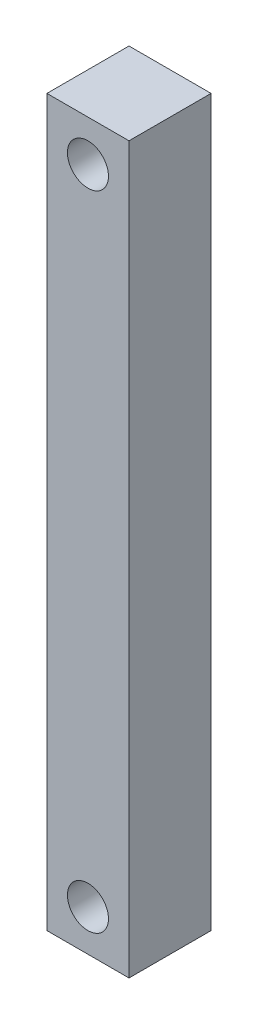
ISO-10303-21;
HEADER;
FILE_DESCRIPTION(('STEP AP214'),'2;1');
FILE_NAME('part.step','',(''),(''),'','','');
FILE_SCHEMA(('AUTOMOTIVE_DESIGN { 1 0 10303 214 1 1 1 1 }'));
ENDSEC;
DATA;
#1=APPLICATION_CONTEXT('core data for automotive mechanical design processes');
#2=APPLICATION_PROTOCOL_DEFINITION('international standard','automotive_design',2000,#1);
#3=PRODUCT_CONTEXT('',#1,'mechanical');
#4=PRODUCT('Part','Part','',(#3));
#5=PRODUCT_RELATED_PRODUCT_CATEGORY('part','',(#4));
#6=PRODUCT_DEFINITION_FORMATION('','',#4);
#7=PRODUCT_DEFINITION_CONTEXT('part definition',#1,'design');
#8=PRODUCT_DEFINITION('design','',#6,#7);
#9=PRODUCT_DEFINITION_SHAPE('','',#8);
#10=(LENGTH_UNIT() NAMED_UNIT(*) SI_UNIT(.MILLI.,.METRE.));
#11=(NAMED_UNIT(*) PLANE_ANGLE_UNIT() SI_UNIT($,.RADIAN.));
#12=(NAMED_UNIT(*) SI_UNIT($,.STERADIAN.) SOLID_ANGLE_UNIT());
#13=UNCERTAINTY_MEASURE_WITH_UNIT(LENGTH_MEASURE(1.E-05),#10,'distance_accuracy_value','');
#14=(GEOMETRIC_REPRESENTATION_CONTEXT(3) GLOBAL_UNCERTAINTY_ASSIGNED_CONTEXT((#13)) GLOBAL_UNIT_ASSIGNED_CONTEXT((#10,
#11,#12)) REPRESENTATION_CONTEXT('',''));
#15=CARTESIAN_POINT('',(0.,0.,0.));
#16=DIRECTION('',(0.,0.,1.));
#17=DIRECTION('',(1.,0.,0.));
#18=AXIS2_PLACEMENT_3D('',#15,#16,#17);
#19=CARTESIAN_POINT('',(-3.,-26.5,6.));
#20=DIRECTION('',(1.,0.,0.));
#21=DIRECTION('',(0.,0.,-1.));
#22=AXIS2_PLACEMENT_3D('',#19,#20,#21);
#23=PLANE('',#22);
#24=DIRECTION('',(0.,-1.,0.));
#25=VECTOR('',#24,1.);
#26=CARTESIAN_POINT('',(-3.,-26.5,0.));
#27=LINE('',#26,#25);
#28=CARTESIAN_POINT('',(-3.,26.5,0.));
#29=VERTEX_POINT('',#28);
#30=CARTESIAN_POINT('',(-3.,-26.5,0.));
#31=VERTEX_POINT('',#30);
#32=EDGE_CURVE('E111',#29,#31,#27,.T.);
#33=ORIENTED_EDGE('',*,*,#32,.T.);
#34=DIRECTION('',(0.,0.,-1.));
#35=VECTOR('',#34,1.);
#36=CARTESIAN_POINT('',(-3.,-26.5,6.));
#37=LINE('',#36,#35);
#38=CARTESIAN_POINT('',(-3.,-26.5,6.));
#39=VERTEX_POINT('',#38);
#40=EDGE_CURVE('E11',#39,#31,#37,.T.);
#41=ORIENTED_EDGE('',*,*,#40,.F.);
#42=DIRECTION('',(0.,-1.,0.));
#43=VECTOR('',#42,1.);
#44=CARTESIAN_POINT('',(-3.,-26.5,6.));
#45=LINE('',#44,#43);
#46=CARTESIAN_POINT('',(-3.,26.5,6.));
#47=VERTEX_POINT('',#46);
#48=EDGE_CURVE('E95',#47,#39,#45,.T.);
#49=ORIENTED_EDGE('',*,*,#48,.F.);
#50=DIRECTION('',(0.,0.,-1.));
#51=VECTOR('',#50,1.);
#52=CARTESIAN_POINT('',(-3.,26.5,6.));
#53=LINE('',#52,#51);
#54=EDGE_CURVE('E107',#47,#29,#53,.T.);
#55=ORIENTED_EDGE('',*,*,#54,.T.);
#56=EDGE_LOOP('',(#33,#41,#49,#55));
#57=FACE_BOUND('',#56,.T.);
#58=ADVANCED_FACE('F43',(#57),#23,.F.);
#59=CARTESIAN_POINT('',(3.,-26.5,6.));
#60=DIRECTION('',(0.,1.,0.));
#61=DIRECTION('',(0.,0.,1.));
#62=AXIS2_PLACEMENT_3D('',#59,#60,#61);
#63=PLANE('',#62);
#64=DIRECTION('',(1.,0.,0.));
#65=VECTOR('',#64,1.);
#66=CARTESIAN_POINT('',(3.,-26.5,0.));
#67=LINE('',#66,#65);
#68=CARTESIAN_POINT('',(3.,-26.5,0.));
#69=VERTEX_POINT('',#68);
#70=EDGE_CURVE('E100',#31,#69,#67,.T.);
#71=ORIENTED_EDGE('',*,*,#70,.T.);
#72=DIRECTION('',(0.,0.,-1.));
#73=VECTOR('',#72,1.);
#74=CARTESIAN_POINT('',(3.,-26.5,6.));
#75=LINE('',#74,#73);
#76=CARTESIAN_POINT('',(3.,-26.5,6.));
#77=VERTEX_POINT('',#76);
#78=EDGE_CURVE('E52',#77,#69,#75,.T.);
#79=ORIENTED_EDGE('',*,*,#78,.F.);
#80=DIRECTION('',(1.,0.,0.));
#81=VECTOR('',#80,1.);
#82=CARTESIAN_POINT('',(3.,-26.5,6.));
#83=LINE('',#82,#81);
#84=EDGE_CURVE('E90',#39,#77,#83,.T.);
#85=ORIENTED_EDGE('',*,*,#84,.F.);
#86=ORIENTED_EDGE('',*,*,#40,.T.);
#87=EDGE_LOOP('',(#71,#79,#85,#86));
#88=FACE_BOUND('',#87,.T.);
#89=ADVANCED_FACE('F99',(#88),#63,.F.);
#90=CARTESIAN_POINT('',(3.,-26.5,6.));
#91=DIRECTION('',(-1.,0.,0.));
#92=DIRECTION('',(0.,0.,1.));
#93=AXIS2_PLACEMENT_3D('',#90,#91,#92);
#94=PLANE('',#93);
#95=DIRECTION('',(0.,1.,0.));
#96=VECTOR('',#95,1.);
#97=CARTESIAN_POINT('',(3.,-26.5,0.));
#98=LINE('',#97,#96);
#99=CARTESIAN_POINT('',(3.,26.5,0.));
#100=VERTEX_POINT('',#99);
#101=EDGE_CURVE('E77',#69,#100,#98,.T.);
#102=ORIENTED_EDGE('',*,*,#101,.T.);
#103=DIRECTION('',(0.,0.,-1.));
#104=VECTOR('',#103,1.);
#105=CARTESIAN_POINT('',(3.,26.5,6.));
#106=LINE('',#105,#104);
#107=CARTESIAN_POINT('',(3.,26.5,6.));
#108=VERTEX_POINT('',#107);
#109=EDGE_CURVE('E102',#108,#100,#106,.T.);
#110=ORIENTED_EDGE('',*,*,#109,.F.);
#111=DIRECTION('',(0.,1.,0.));
#112=VECTOR('',#111,1.);
#113=CARTESIAN_POINT('',(3.,-26.5,6.));
#114=LINE('',#113,#112);
#115=EDGE_CURVE('E93',#77,#108,#114,.T.);
#116=ORIENTED_EDGE('',*,*,#115,.F.);
#117=ORIENTED_EDGE('',*,*,#78,.T.);
#118=EDGE_LOOP('',(#102,#110,#116,#117));
#119=FACE_BOUND('',#118,.T.);
#120=ADVANCED_FACE('F103',(#119),#94,.F.);
#121=CARTESIAN_POINT('',(3.,26.5,6.));
#122=DIRECTION('',(0.,-1.,0.));
#123=DIRECTION('',(0.,0.,-1.));
#124=AXIS2_PLACEMENT_3D('',#121,#122,#123);
#125=PLANE('',#124);
#126=DIRECTION('',(-1.,0.,0.));
#127=VECTOR('',#126,1.);
#128=CARTESIAN_POINT('',(3.,26.5,0.));
#129=LINE('',#128,#127);
#130=EDGE_CURVE('E83',#100,#29,#129,.T.);
#131=ORIENTED_EDGE('',*,*,#130,.T.);
#132=ORIENTED_EDGE('',*,*,#54,.F.);
#133=DIRECTION('',(-1.,0.,0.));
#134=VECTOR('',#133,1.);
#135=CARTESIAN_POINT('',(3.,26.5,6.));
#136=LINE('',#135,#134);
#137=EDGE_CURVE('E60',#108,#47,#136,.T.);
#138=ORIENTED_EDGE('',*,*,#137,.F.);
#139=ORIENTED_EDGE('',*,*,#109,.T.);
#140=EDGE_LOOP('',(#131,#132,#138,#139));
#141=FACE_BOUND('',#140,.T.);
#142=ADVANCED_FACE('F125',(#141),#125,.F.);
#143=CARTESIAN_POINT('',(0.,0.,6.));
#144=DIRECTION('',(0.,0.,1.));
#145=DIRECTION('',(1.,0.,0.));
#146=AXIS2_PLACEMENT_3D('',#143,#144,#145);
#147=PLANE('',#146);
#148=CARTESIAN_POINT('',(0.,23.5,6.));
#149=DIRECTION('',(0.,0.,1.));
#150=DIRECTION('',(1.,0.,0.));
#151=AXIS2_PLACEMENT_3D('',#148,#149,#150);
#152=CIRCLE('',#151,1.5);
#153=CARTESIAN_POINT('',(1.5,23.5,6.));
#154=VERTEX_POINT('',#153);
#155=EDGE_CURVE('E140',#154,#154,#152,.T.);
#156=ORIENTED_EDGE('',*,*,#155,.F.);
#157=EDGE_LOOP('',(#156));
#158=FACE_BOUND('',#157,.T.);
#159=CARTESIAN_POINT('',(0.,-23.5,6.));
#160=DIRECTION('',(0.,0.,1.));
#161=DIRECTION('',(-1.,0.,0.));
#162=AXIS2_PLACEMENT_3D('',#159,#160,#161);
#163=CIRCLE('',#162,1.5);
#164=CARTESIAN_POINT('',(-1.5,-23.5,6.));
#165=VERTEX_POINT('',#164);
#166=EDGE_CURVE('E136',#165,#165,#163,.T.);
#167=ORIENTED_EDGE('',*,*,#166,.F.);
#168=EDGE_LOOP('',(#167));
#169=FACE_BOUND('',#168,.T.);
#170=ORIENTED_EDGE('',*,*,#48,.T.);
#171=ORIENTED_EDGE('',*,*,#84,.T.);
#172=ORIENTED_EDGE('',*,*,#115,.T.);
#173=ORIENTED_EDGE('',*,*,#137,.T.);
#174=EDGE_LOOP('',(#170,#171,#172,#173));
#175=FACE_BOUND('',#174,.T.);
#176=ADVANCED_FACE('F91',(#158,#169,#175),#147,.T.);
#177=CARTESIAN_POINT('',(0.,0.,0.));
#178=DIRECTION('',(0.,0.,1.));
#179=DIRECTION('',(1.,0.,0.));
#180=AXIS2_PLACEMENT_3D('',#177,#178,#179);
#181=PLANE('',#180);
#182=CARTESIAN_POINT('',(0.,23.5,0.));
#183=DIRECTION('',(0.,0.,1.));
#184=DIRECTION('',(1.,0.,0.));
#185=AXIS2_PLACEMENT_3D('',#182,#183,#184);
#186=CIRCLE('',#185,1.5);
#187=CARTESIAN_POINT('',(1.5,23.5,0.));
#188=VERTEX_POINT('',#187);
#189=EDGE_CURVE('E115',#188,#188,#186,.T.);
#190=ORIENTED_EDGE('',*,*,#189,.T.);
#191=EDGE_LOOP('',(#190));
#192=FACE_BOUND('',#191,.T.);
#193=CARTESIAN_POINT('',(0.,-23.5,0.));
#194=DIRECTION('',(0.,0.,1.));
#195=DIRECTION('',(-1.,0.,0.));
#196=AXIS2_PLACEMENT_3D('',#193,#194,#195);
#197=CIRCLE('',#196,1.5);
#198=CARTESIAN_POINT('',(-1.5,-23.5,0.));
#199=VERTEX_POINT('',#198);
#200=EDGE_CURVE('E132',#199,#199,#197,.T.);
#201=ORIENTED_EDGE('',*,*,#200,.T.);
#202=EDGE_LOOP('',(#201));
#203=FACE_BOUND('',#202,.T.);
#204=ORIENTED_EDGE('',*,*,#32,.F.);
#205=ORIENTED_EDGE('',*,*,#130,.F.);
#206=ORIENTED_EDGE('',*,*,#101,.F.);
#207=ORIENTED_EDGE('',*,*,#70,.F.);
#208=EDGE_LOOP('',(#204,#205,#206,#207));
#209=FACE_BOUND('',#208,.T.);
#210=ADVANCED_FACE('F128',(#192,#203,#209),#181,.F.);
#211=CARTESIAN_POINT('',(0.,-23.5,0.));
#212=DIRECTION('',(0.,0.,1.));
#213=DIRECTION('',(1.,0.,0.));
#214=AXIS2_PLACEMENT_3D('',#211,#212,#213);
#215=CYLINDRICAL_SURFACE('',#214,1.5);
#216=ORIENTED_EDGE('',*,*,#200,.F.);
#217=EDGE_LOOP('',(#216));
#218=FACE_BOUND('',#217,.T.);
#219=ORIENTED_EDGE('',*,*,#166,.T.);
#220=EDGE_LOOP('',(#219));
#221=FACE_BOUND('',#220,.T.);
#222=ADVANCED_FACE('F153',(#218,#221),#215,.F.);
#223=CARTESIAN_POINT('',(0.,23.5,0.));
#224=DIRECTION('',(0.,0.,1.));
#225=DIRECTION('',(1.,0.,0.));
#226=AXIS2_PLACEMENT_3D('',#223,#224,#225);
#227=CYLINDRICAL_SURFACE('',#226,1.5);
#228=ORIENTED_EDGE('',*,*,#189,.F.);
#229=EDGE_LOOP('',(#228));
#230=FACE_BOUND('',#229,.T.);
#231=ORIENTED_EDGE('',*,*,#155,.T.);
#232=EDGE_LOOP('',(#231));
#233=FACE_BOUND('',#232,.T.);
#234=ADVANCED_FACE('F150',(#230,#233),#227,.F.);
#235=CLOSED_SHELL('',(#58,#89,#120,#142,#176,#210,#222,#234));
#236=MANIFOLD_SOLID_BREP('B2',#235);
#237=ADVANCED_BREP_SHAPE_REPRESENTATION('',(#18,#236),#14);
#238=SHAPE_DEFINITION_REPRESENTATION(#9,#237);
ENDSEC;
END-ISO-10303-21;
